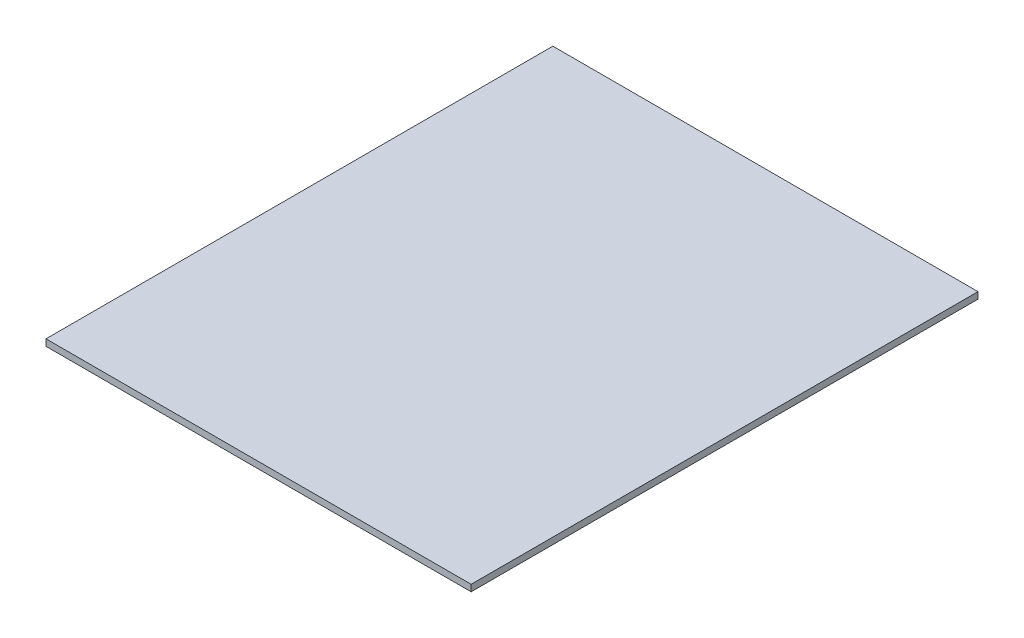
ISO-10303-21;
HEADER;
FILE_DESCRIPTION(('STEP AP214'),'2;1');
FILE_NAME('part.step','',(''),(''),'','','');
FILE_SCHEMA(('AUTOMOTIVE_DESIGN { 1 0 10303 214 1 1 1 1 }'));
ENDSEC;
DATA;
#1=APPLICATION_CONTEXT('core data for automotive mechanical design processes');
#2=APPLICATION_PROTOCOL_DEFINITION('international standard','automotive_design',2000,#1);
#3=PRODUCT_CONTEXT('',#1,'mechanical');
#4=PRODUCT('Part','Part','',(#3));
#5=PRODUCT_RELATED_PRODUCT_CATEGORY('part','',(#4));
#6=PRODUCT_DEFINITION_FORMATION('','',#4);
#7=PRODUCT_DEFINITION_CONTEXT('part definition',#1,'design');
#8=PRODUCT_DEFINITION('design','',#6,#7);
#9=PRODUCT_DEFINITION_SHAPE('','',#8);
#10=(LENGTH_UNIT() NAMED_UNIT(*) SI_UNIT(.MILLI.,.METRE.));
#11=(NAMED_UNIT(*) PLANE_ANGLE_UNIT() SI_UNIT($,.RADIAN.));
#12=(NAMED_UNIT(*) SI_UNIT($,.STERADIAN.) SOLID_ANGLE_UNIT());
#13=UNCERTAINTY_MEASURE_WITH_UNIT(LENGTH_MEASURE(1.E-05),#10,'distance_accuracy_value','');
#14=(GEOMETRIC_REPRESENTATION_CONTEXT(3) GLOBAL_UNCERTAINTY_ASSIGNED_CONTEXT((#13)) GLOBAL_UNIT_ASSIGNED_CONTEXT((#10,
#11,#12)) REPRESENTATION_CONTEXT('',''));
#15=CARTESIAN_POINT('',(0.,0.,0.));
#16=DIRECTION('',(0.,0.,1.));
#17=DIRECTION('',(1.,0.,0.));
#18=AXIS2_PLACEMENT_3D('',#15,#16,#17);
#19=CARTESIAN_POINT('',(325.,10.,387.475));
#20=DIRECTION('',(-1.,0.,0.));
#21=DIRECTION('',(0.,0.,1.));
#22=AXIS2_PLACEMENT_3D('',#19,#20,#21);
#23=PLANE('',#22);
#24=DIRECTION('',(0.,0.,-1.));
#25=VECTOR('',#24,1.);
#26=CARTESIAN_POINT('',(325.,0.,387.475));
#27=LINE('',#26,#25);
#28=CARTESIAN_POINT('',(325.,0.,387.475));
#29=VERTEX_POINT('',#28);
#30=CARTESIAN_POINT('',(325.,0.,-387.475));
#31=VERTEX_POINT('',#30);
#32=EDGE_CURVE('E101',#29,#31,#27,.T.);
#33=ORIENTED_EDGE('',*,*,#32,.T.);
#34=DIRECTION('',(0.,-1.,0.));
#35=VECTOR('',#34,1.);
#36=CARTESIAN_POINT('',(325.,10.,-387.475));
#37=LINE('',#36,#35);
#38=CARTESIAN_POINT('',(325.,10.,-387.475));
#39=VERTEX_POINT('',#38);
#40=EDGE_CURVE('E92',#39,#31,#37,.T.);
#41=ORIENTED_EDGE('',*,*,#40,.F.);
#42=DIRECTION('',(0.,0.,-1.));
#43=VECTOR('',#42,1.);
#44=CARTESIAN_POINT('',(325.,10.,387.475));
#45=LINE('',#44,#43);
#46=CARTESIAN_POINT('',(325.,10.,387.475));
#47=VERTEX_POINT('',#46);
#48=EDGE_CURVE('E86',#47,#39,#45,.T.);
#49=ORIENTED_EDGE('',*,*,#48,.F.);
#50=DIRECTION('',(0.,-1.,0.));
#51=VECTOR('',#50,1.);
#52=CARTESIAN_POINT('',(325.,10.,387.475));
#53=LINE('',#52,#51);
#54=EDGE_CURVE('E97',#47,#29,#53,.T.);
#55=ORIENTED_EDGE('',*,*,#54,.T.);
#56=EDGE_LOOP('',(#33,#41,#49,#55));
#57=FACE_BOUND('',#56,.T.);
#58=ADVANCED_FACE('F34',(#57),#23,.F.);
#59=CARTESIAN_POINT('',(-325.,10.,-387.475));
#60=DIRECTION('',(0.,0.,1.));
#61=DIRECTION('',(1.,0.,0.));
#62=AXIS2_PLACEMENT_3D('',#59,#60,#61);
#63=PLANE('',#62);
#64=DIRECTION('',(-1.,0.,0.));
#65=VECTOR('',#64,1.);
#66=CARTESIAN_POINT('',(-325.,0.,-387.475));
#67=LINE('',#66,#65);
#68=CARTESIAN_POINT('',(-325.,0.,-387.475));
#69=VERTEX_POINT('',#68);
#70=EDGE_CURVE('E91',#31,#69,#67,.T.);
#71=ORIENTED_EDGE('',*,*,#70,.T.);
#72=DIRECTION('',(0.,-1.,0.));
#73=VECTOR('',#72,1.);
#74=CARTESIAN_POINT('',(-325.,10.,-387.475));
#75=LINE('',#74,#73);
#76=CARTESIAN_POINT('',(-325.,10.,-387.475));
#77=VERTEX_POINT('',#76);
#78=EDGE_CURVE('E89',#77,#69,#75,.T.);
#79=ORIENTED_EDGE('',*,*,#78,.F.);
#80=DIRECTION('',(-1.,0.,0.));
#81=VECTOR('',#80,1.);
#82=CARTESIAN_POINT('',(-325.,10.,-387.475));
#83=LINE('',#82,#81);
#84=EDGE_CURVE('E81',#39,#77,#83,.T.);
#85=ORIENTED_EDGE('',*,*,#84,.F.);
#86=ORIENTED_EDGE('',*,*,#40,.T.);
#87=EDGE_LOOP('',(#71,#79,#85,#86));
#88=FACE_BOUND('',#87,.T.);
#89=ADVANCED_FACE('F90',(#88),#63,.F.);
#90=CARTESIAN_POINT('',(-325.,10.,387.475));
#91=DIRECTION('',(1.,0.,0.));
#92=DIRECTION('',(0.,0.,-1.));
#93=AXIS2_PLACEMENT_3D('',#90,#91,#92);
#94=PLANE('',#93);
#95=DIRECTION('',(0.,0.,1.));
#96=VECTOR('',#95,1.);
#97=CARTESIAN_POINT('',(-325.,0.,387.475));
#98=LINE('',#97,#96);
#99=CARTESIAN_POINT('',(-325.,0.,387.475));
#100=VERTEX_POINT('',#99);
#101=EDGE_CURVE('E67',#69,#100,#98,.T.);
#102=ORIENTED_EDGE('',*,*,#101,.T.);
#103=DIRECTION('',(0.,-1.,0.));
#104=VECTOR('',#103,1.);
#105=CARTESIAN_POINT('',(-325.,10.,387.475));
#106=LINE('',#105,#104);
#107=CARTESIAN_POINT('',(-325.,10.,387.475));
#108=VERTEX_POINT('',#107);
#109=EDGE_CURVE('E93',#108,#100,#106,.T.);
#110=ORIENTED_EDGE('',*,*,#109,.F.);
#111=DIRECTION('',(0.,0.,1.));
#112=VECTOR('',#111,1.);
#113=CARTESIAN_POINT('',(-325.,10.,387.475));
#114=LINE('',#113,#112);
#115=EDGE_CURVE('E84',#77,#108,#114,.T.);
#116=ORIENTED_EDGE('',*,*,#115,.F.);
#117=ORIENTED_EDGE('',*,*,#78,.T.);
#118=EDGE_LOOP('',(#102,#110,#116,#117));
#119=FACE_BOUND('',#118,.T.);
#120=ADVANCED_FACE('F95',(#119),#94,.F.);
#121=CARTESIAN_POINT('',(-325.,10.,387.475));
#122=DIRECTION('',(0.,0.,-1.));
#123=DIRECTION('',(-1.,0.,0.));
#124=AXIS2_PLACEMENT_3D('',#121,#122,#123);
#125=PLANE('',#124);
#126=DIRECTION('',(1.,0.,0.));
#127=VECTOR('',#126,1.);
#128=CARTESIAN_POINT('',(-325.,0.,387.475));
#129=LINE('',#128,#127);
#130=EDGE_CURVE('E73',#100,#29,#129,.T.);
#131=ORIENTED_EDGE('',*,*,#130,.T.);
#132=ORIENTED_EDGE('',*,*,#54,.F.);
#133=DIRECTION('',(1.,0.,0.));
#134=VECTOR('',#133,1.);
#135=CARTESIAN_POINT('',(-325.,10.,387.475));
#136=LINE('',#135,#134);
#137=EDGE_CURVE('E50',#108,#47,#136,.T.);
#138=ORIENTED_EDGE('',*,*,#137,.F.);
#139=ORIENTED_EDGE('',*,*,#109,.T.);
#140=EDGE_LOOP('',(#131,#132,#138,#139));
#141=FACE_BOUND('',#140,.T.);
#142=ADVANCED_FACE('F131',(#141),#125,.F.);
#143=CARTESIAN_POINT('',(0.,10.,0.));
#144=DIRECTION('',(0.,-1.,0.));
#145=DIRECTION('',(0.,0.,-1.));
#146=AXIS2_PLACEMENT_3D('',#143,#144,#145);
#147=PLANE('',#146);
#148=ORIENTED_EDGE('',*,*,#48,.T.);
#149=ORIENTED_EDGE('',*,*,#84,.T.);
#150=ORIENTED_EDGE('',*,*,#115,.T.);
#151=ORIENTED_EDGE('',*,*,#137,.T.);
#152=EDGE_LOOP('',(#148,#149,#150,#151));
#153=FACE_BOUND('',#152,.T.);
#154=ADVANCED_FACE('F82',(#153),#147,.F.);
#155=CARTESIAN_POINT('',(0.,0.,0.));
#156=DIRECTION('',(0.,-1.,0.));
#157=DIRECTION('',(0.,0.,-1.));
#158=AXIS2_PLACEMENT_3D('',#155,#156,#157);
#159=PLANE('',#158);
#160=CARTESIAN_POINT('',(196.467972545816,0.,-369.975));
#161=DIRECTION('',(0.,-1.,0.));
#162=DIRECTION('',(0.,0.,-1.));
#163=AXIS2_PLACEMENT_3D('',#160,#161,#162);
#164=CIRCLE('',#163,2.99999999999999);
#165=CARTESIAN_POINT('',(196.467972545816,0.,-372.975));
#166=VERTEX_POINT('',#165);
#167=EDGE_CURVE('E11',#166,#166,#164,.T.);
#168=ORIENTED_EDGE('',*,*,#167,.F.);
#169=EDGE_LOOP('',(#168));
#170=FACE_BOUND('',#169,.T.);
#171=CARTESIAN_POINT('',(-203.532027454184,0.,-369.975));
#172=DIRECTION('',(0.,-1.,0.));
#173=DIRECTION('',(0.,0.,-1.));
#174=AXIS2_PLACEMENT_3D('',#171,#172,#173);
#175=CIRCLE('',#174,2.99999999999999);
#176=CARTESIAN_POINT('',(-203.532027454184,0.,-372.975));
#177=VERTEX_POINT('',#176);
#178=EDGE_CURVE('E42',#177,#177,#175,.T.);
#179=ORIENTED_EDGE('',*,*,#178,.F.);
#180=EDGE_LOOP('',(#179));
#181=FACE_BOUND('',#180,.T.);
#182=CARTESIAN_POINT('',(196.467972545816,0.,369.975));
#183=DIRECTION('',(0.,-1.,0.));
#184=DIRECTION('',(0.,0.,-1.));
#185=AXIS2_PLACEMENT_3D('',#182,#183,#184);
#186=CIRCLE('',#185,2.99999999999999);
#187=CARTESIAN_POINT('',(196.467972545816,0.,366.975));
#188=VERTEX_POINT('',#187);
#189=EDGE_CURVE('E124',#188,#188,#186,.T.);
#190=ORIENTED_EDGE('',*,*,#189,.F.);
#191=EDGE_LOOP('',(#190));
#192=FACE_BOUND('',#191,.T.);
#193=CARTESIAN_POINT('',(-203.532027454184,0.,369.975));
#194=DIRECTION('',(0.,-1.,0.));
#195=DIRECTION('',(0.,0.,-1.));
#196=AXIS2_PLACEMENT_3D('',#193,#194,#195);
#197=CIRCLE('',#196,2.99999999999999);
#198=CARTESIAN_POINT('',(-203.532027454184,0.,366.975));
#199=VERTEX_POINT('',#198);
#200=EDGE_CURVE('E128',#199,#199,#197,.T.);
#201=ORIENTED_EDGE('',*,*,#200,.F.);
#202=EDGE_LOOP('',(#201));
#203=FACE_BOUND('',#202,.T.);
#204=ORIENTED_EDGE('',*,*,#32,.F.);
#205=ORIENTED_EDGE('',*,*,#130,.F.);
#206=ORIENTED_EDGE('',*,*,#101,.F.);
#207=ORIENTED_EDGE('',*,*,#70,.F.);
#208=EDGE_LOOP('',(#204,#205,#206,#207));
#209=FACE_BOUND('',#208,.T.);
#210=ADVANCED_FACE('F115',(#170,#181,#192,#203,#209),#159,.T.);
#211=CARTESIAN_POINT('',(-203.532027454184,-10.,369.975));
#212=DIRECTION('',(0.,1.,0.));
#213=DIRECTION('',(0.,0.,1.));
#214=AXIS2_PLACEMENT_3D('',#211,#212,#213);
#215=CYLINDRICAL_SURFACE('',#214,2.99999999999999);
#216=CARTESIAN_POINT('',(-203.532027454184,-10.,369.975));
#217=DIRECTION('',(0.,-1.,0.));
#218=DIRECTION('',(0.,0.,-1.));
#219=AXIS2_PLACEMENT_3D('',#216,#217,#218);
#220=CIRCLE('',#219,2.99999999999999);
#221=CARTESIAN_POINT('',(-203.532027454184,-10.,366.975));
#222=VERTEX_POINT('',#221);
#223=EDGE_CURVE('E104',#222,#222,#220,.T.);
#224=ORIENTED_EDGE('',*,*,#223,.F.);
#225=EDGE_LOOP('',(#224));
#226=FACE_BOUND('',#225,.T.);
#227=ORIENTED_EDGE('',*,*,#200,.T.);
#228=EDGE_LOOP('',(#227));
#229=FACE_BOUND('',#228,.T.);
#230=ADVANCED_FACE('F118',(#226,#229),#215,.T.);
#231=CARTESIAN_POINT('',(-203.532027454184,-10.,369.975));
#232=DIRECTION('',(0.,-1.,0.));
#233=DIRECTION('',(0.,0.,-1.));
#234=AXIS2_PLACEMENT_3D('',#231,#232,#233);
#235=PLANE('',#234);
#236=ORIENTED_EDGE('',*,*,#223,.T.);
#237=EDGE_LOOP('',(#236));
#238=FACE_BOUND('',#237,.T.);
#239=ADVANCED_FACE('F170',(#238),#235,.T.);
#240=CARTESIAN_POINT('',(196.467972545816,-10.,369.975));
#241=DIRECTION('',(0.,1.,0.));
#242=DIRECTION('',(0.,0.,1.));
#243=AXIS2_PLACEMENT_3D('',#240,#241,#242);
#244=CYLINDRICAL_SURFACE('',#243,2.99999999999999);
#245=CARTESIAN_POINT('',(196.467972545816,-10.,369.975));
#246=DIRECTION('',(0.,-1.,0.));
#247=DIRECTION('',(0.,0.,-1.));
#248=AXIS2_PLACEMENT_3D('',#245,#246,#247);
#249=CIRCLE('',#248,2.99999999999999);
#250=CARTESIAN_POINT('',(196.467972545816,-10.,366.975));
#251=VERTEX_POINT('',#250);
#252=EDGE_CURVE('E256',#251,#251,#249,.T.);
#253=ORIENTED_EDGE('',*,*,#252,.F.);
#254=EDGE_LOOP('',(#253));
#255=FACE_BOUND('',#254,.T.);
#256=ORIENTED_EDGE('',*,*,#189,.T.);
#257=EDGE_LOOP('',(#256));
#258=FACE_BOUND('',#257,.T.);
#259=ADVANCED_FACE('F180',(#255,#258),#244,.T.);
#260=CARTESIAN_POINT('',(196.467972545816,-10.,369.975));
#261=DIRECTION('',(0.,-1.,0.));
#262=DIRECTION('',(0.,0.,-1.));
#263=AXIS2_PLACEMENT_3D('',#260,#261,#262);
#264=PLANE('',#263);
#265=ORIENTED_EDGE('',*,*,#252,.T.);
#266=EDGE_LOOP('',(#265));
#267=FACE_BOUND('',#266,.T.);
#268=ADVANCED_FACE('F190',(#267),#264,.T.);
#269=CARTESIAN_POINT('',(-203.532027454184,-10.,-369.975));
#270=DIRECTION('',(0.,1.,0.));
#271=DIRECTION('',(0.,0.,1.));
#272=AXIS2_PLACEMENT_3D('',#269,#270,#271);
#273=CYLINDRICAL_SURFACE('',#272,2.99999999999999);
#274=CARTESIAN_POINT('',(-203.532027454184,-10.,-369.975));
#275=DIRECTION('',(0.,1.,0.));
#276=DIRECTION('',(0.,0.,1.));
#277=AXIS2_PLACEMENT_3D('',#274,#275,#276);
#278=CIRCLE('',#277,2.99999999999999);
#279=CARTESIAN_POINT('',(-203.532027454184,-10.,-366.975));
#280=VERTEX_POINT('',#279);
#281=EDGE_CURVE('E251',#280,#280,#278,.T.);
#282=ORIENTED_EDGE('',*,*,#281,.T.);
#283=EDGE_LOOP('',(#282));
#284=FACE_BOUND('',#283,.T.);
#285=ORIENTED_EDGE('',*,*,#178,.T.);
#286=EDGE_LOOP('',(#285));
#287=FACE_BOUND('',#286,.T.);
#288=ADVANCED_FACE('F113',(#284,#287),#273,.T.);
#289=CARTESIAN_POINT('',(-203.532027454184,-10.,-369.975));
#290=DIRECTION('',(0.,-1.,0.));
#291=DIRECTION('',(0.,0.,1.));
#292=AXIS2_PLACEMENT_3D('',#289,#290,#291);
#293=PLANE('',#292);
#294=ORIENTED_EDGE('',*,*,#281,.F.);
#295=EDGE_LOOP('',(#294));
#296=FACE_BOUND('',#295,.T.);
#297=ADVANCED_FACE('F214',(#296),#293,.T.);
#298=CARTESIAN_POINT('',(196.467972545816,-10.,-369.975));
#299=DIRECTION('',(0.,1.,0.));
#300=DIRECTION('',(0.,0.,1.));
#301=AXIS2_PLACEMENT_3D('',#298,#299,#300);
#302=CYLINDRICAL_SURFACE('',#301,2.99999999999999);
#303=CARTESIAN_POINT('',(196.467972545816,-10.,-369.975));
#304=DIRECTION('',(0.,1.,0.));
#305=DIRECTION('',(0.,0.,1.));
#306=AXIS2_PLACEMENT_3D('',#303,#304,#305);
#307=CIRCLE('',#306,2.99999999999999);
#308=CARTESIAN_POINT('',(196.467972545816,-10.,-366.975));
#309=VERTEX_POINT('',#308);
#310=EDGE_CURVE('E250',#309,#309,#307,.T.);
#311=ORIENTED_EDGE('',*,*,#310,.T.);
#312=EDGE_LOOP('',(#311));
#313=FACE_BOUND('',#312,.T.);
#314=ORIENTED_EDGE('',*,*,#167,.T.);
#315=EDGE_LOOP('',(#314));
#316=FACE_BOUND('',#315,.T.);
#317=ADVANCED_FACE('F224',(#313,#316),#302,.T.);
#318=CARTESIAN_POINT('',(196.467972545816,-10.,-369.975));
#319=DIRECTION('',(0.,-1.,0.));
#320=DIRECTION('',(0.,0.,1.));
#321=AXIS2_PLACEMENT_3D('',#318,#319,#320);
#322=PLANE('',#321);
#323=ORIENTED_EDGE('',*,*,#310,.F.);
#324=EDGE_LOOP('',(#323));
#325=FACE_BOUND('',#324,.T.);
#326=ADVANCED_FACE('F234',(#325),#322,.T.);
#327=CLOSED_SHELL('',(#58,#89,#120,#142,#154,#210,#230,#239,#259,#268,#288,#297,#317,#326));
#328=MANIFOLD_SOLID_BREP('B2',#327);
#329=ADVANCED_BREP_SHAPE_REPRESENTATION('',(#18,#328),#14);
#330=SHAPE_DEFINITION_REPRESENTATION(#9,#329);
ENDSEC;
END-ISO-10303-21;
